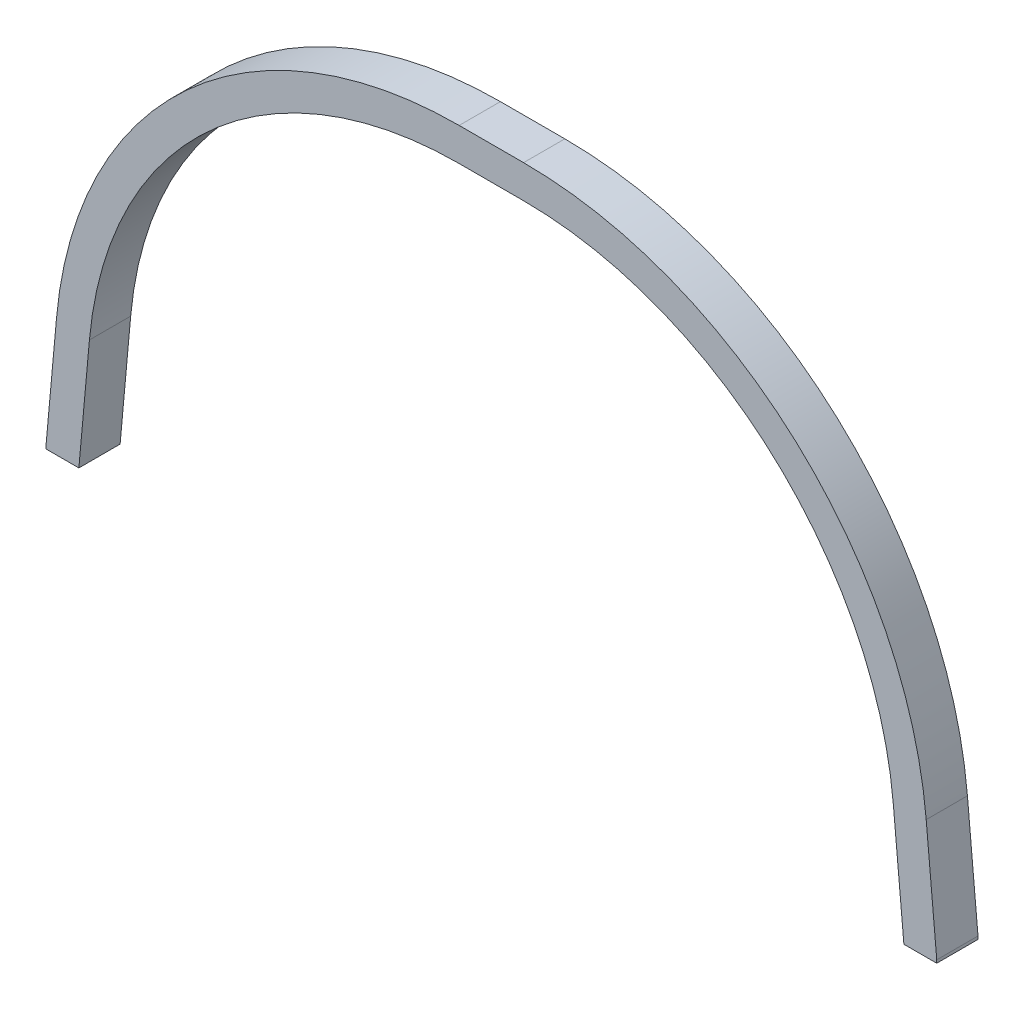
ISO-10303-21;
HEADER;
FILE_DESCRIPTION(('STEP AP214'),'2;1');
FILE_NAME('part.step','',(''),(''),'','','');
FILE_SCHEMA(('AUTOMOTIVE_DESIGN { 1 0 10303 214 1 1 1 1 }'));
ENDSEC;
DATA;
#1=APPLICATION_CONTEXT('core data for automotive mechanical design processes');
#2=APPLICATION_PROTOCOL_DEFINITION('international standard','automotive_design',2000,#1);
#3=PRODUCT_CONTEXT('',#1,'mechanical');
#4=PRODUCT('Part','Part','',(#3));
#5=PRODUCT_RELATED_PRODUCT_CATEGORY('part','',(#4));
#6=PRODUCT_DEFINITION_FORMATION('','',#4);
#7=PRODUCT_DEFINITION_CONTEXT('part definition',#1,'design');
#8=PRODUCT_DEFINITION('design','',#6,#7);
#9=PRODUCT_DEFINITION_SHAPE('','',#8);
#10=(LENGTH_UNIT() NAMED_UNIT(*) SI_UNIT(.MILLI.,.METRE.));
#11=(NAMED_UNIT(*) PLANE_ANGLE_UNIT() SI_UNIT($,.RADIAN.));
#12=(NAMED_UNIT(*) SI_UNIT($,.STERADIAN.) SOLID_ANGLE_UNIT());
#13=UNCERTAINTY_MEASURE_WITH_UNIT(LENGTH_MEASURE(1.E-05),#10,'distance_accuracy_value','');
#14=(GEOMETRIC_REPRESENTATION_CONTEXT(3) GLOBAL_UNCERTAINTY_ASSIGNED_CONTEXT((#13)) GLOBAL_UNIT_ASSIGNED_CONTEXT((#10,
#11,#12)) REPRESENTATION_CONTEXT('',''));
#15=CARTESIAN_POINT('',(0.,0.,0.));
#16=DIRECTION('',(0.,0.,1.));
#17=DIRECTION('',(1.,0.,0.));
#18=AXIS2_PLACEMENT_3D('',#15,#16,#17);
#19=CARTESIAN_POINT('',(0.,0.,5.));
#20=DIRECTION('',(0.,0.,-1.));
#21=DIRECTION('',(-1.,0.,0.));
#22=AXIS2_PLACEMENT_3D('',#19,#20,#21);
#23=PLANE('',#22);
#24=DIRECTION('',(0.,1.,0.));
#25=VECTOR('',#24,1.);
#26=CARTESIAN_POINT('',(141.483572825871,4.99999999999978,5.));
#27=LINE('',#26,#25);
#28=CARTESIAN_POINT('',(141.483572825871,4.99999999999978,5.));
#29=VERTEX_POINT('',#28);
#30=CARTESIAN_POINT('',(141.483572825871,5.3621429841698,5.));
#31=VERTEX_POINT('',#30);
#32=EDGE_CURVE('E147',#29,#31,#27,.T.);
#33=ORIENTED_EDGE('',*,*,#32,.T.);
#34=DIRECTION('',(0.0905357460425166,-0.995893206467704,0.));
#35=VECTOR('',#34,1.);
#36=CARTESIAN_POINT('',(140.204108410242,19.4362515560834,5.));
#37=LINE('',#36,#35);
#38=CARTESIAN_POINT('',(140.204108410242,19.4362515560834,5.));
#39=VERTEX_POINT('',#38);
#40=EDGE_CURVE('E335',#39,#31,#37,.T.);
#41=ORIENTED_EDGE('',*,*,#40,.F.);
#42=CARTESIAN_POINT('',(91.4053412933249,15.,5.));
#43=DIRECTION('',(0.,0.,1.));
#44=DIRECTION('',(1.,0.,0.));
#45=AXIS2_PLACEMENT_3D('',#42,#43,#44);
#46=CIRCLE('',#45,49.);
#47=CARTESIAN_POINT('',(91.4053412933249,64.,5.));
#48=VERTEX_POINT('',#47);
#49=EDGE_CURVE('E339',#39,#48,#46,.T.);
#50=ORIENTED_EDGE('',*,*,#49,.T.);
#51=DIRECTION('',(1.,0.,0.));
#52=VECTOR('',#51,1.);
#53=CARTESIAN_POINT('',(83.5946587066751,64.,5.));
#54=LINE('',#53,#52);
#55=CARTESIAN_POINT('',(83.5946587066751,64.,5.));
#56=VERTEX_POINT('',#55);
#57=EDGE_CURVE('E312',#56,#48,#54,.T.);
#58=ORIENTED_EDGE('',*,*,#57,.F.);
#59=CARTESIAN_POINT('',(83.5946587066751,15.,5.));
#60=DIRECTION('',(0.,0.,1.));
#61=DIRECTION('',(1.,0.,0.));
#62=AXIS2_PLACEMENT_3D('',#59,#60,#61);
#63=CIRCLE('',#62,49.);
#64=CARTESIAN_POINT('',(34.7958915897577,19.4362515560834,5.));
#65=VERTEX_POINT('',#64);
#66=EDGE_CURVE('E307',#56,#65,#63,.T.);
#67=ORIENTED_EDGE('',*,*,#66,.T.);
#68=DIRECTION('',(0.090535746042518,0.995893206467704,0.));
#69=VECTOR('',#68,1.);
#70=CARTESIAN_POINT('',(33.5164271741292,5.36214298417007,5.));
#71=LINE('',#70,#69);
#72=CARTESIAN_POINT('',(33.5164271741292,5.36214298417007,5.));
#73=VERTEX_POINT('',#72);
#74=EDGE_CURVE('E301',#73,#65,#71,.T.);
#75=ORIENTED_EDGE('',*,*,#74,.F.);
#76=DIRECTION('',(0.,1.,0.));
#77=VECTOR('',#76,1.);
#78=CARTESIAN_POINT('',(33.5164271741292,5.,5.));
#79=LINE('',#78,#77);
#80=CARTESIAN_POINT('',(33.5164271741292,5.,5.));
#81=VERTEX_POINT('',#80);
#82=EDGE_CURVE('E165',#81,#73,#79,.T.);
#83=ORIENTED_EDGE('',*,*,#82,.F.);
#84=DIRECTION('',(-1.,0.,0.));
#85=VECTOR('',#84,1.);
#86=CARTESIAN_POINT('',(23.75,5.,5.));
#87=LINE('',#86,#85);
#88=CARTESIAN_POINT('',(37.5,5.,5.));
#89=VERTEX_POINT('',#88);
#90=EDGE_CURVE('E152',#89,#81,#87,.T.);
#91=ORIENTED_EDGE('',*,*,#90,.F.);
#92=DIRECTION('',(0.0905357460425184,0.995893206467704,0.));
#93=VECTOR('',#92,1.);
#94=CARTESIAN_POINT('',(37.5,5.,5.));
#95=LINE('',#94,#93);
#96=CARTESIAN_POINT('',(38.7794644156285,19.0741085719133,5.));
#97=VERTEX_POINT('',#96);
#98=EDGE_CURVE('E182',#89,#97,#95,.T.);
#99=ORIENTED_EDGE('',*,*,#98,.T.);
#100=CARTESIAN_POINT('',(83.5946587066751,15.,5.));
#101=DIRECTION('',(0.,0.,-1.));
#102=DIRECTION('',(-1.,0.,0.));
#103=AXIS2_PLACEMENT_3D('',#100,#101,#102);
#104=CIRCLE('',#103,45.);
#105=CARTESIAN_POINT('',(83.5946587066751,60.,5.));
#106=VERTEX_POINT('',#105);
#107=EDGE_CURVE('E11',#97,#106,#104,.T.);
#108=ORIENTED_EDGE('',*,*,#107,.T.);
#109=DIRECTION('',(1.,0.,0.));
#110=VECTOR('',#109,1.);
#111=CARTESIAN_POINT('',(132.5,60.,5.));
#112=LINE('',#111,#110);
#113=CARTESIAN_POINT('',(91.4053412933249,60.,5.));
#114=VERTEX_POINT('',#113);
#115=EDGE_CURVE('E185',#106,#114,#112,.T.);
#116=ORIENTED_EDGE('',*,*,#115,.T.);
#117=CARTESIAN_POINT('',(91.4053412933249,15.,5.));
#118=DIRECTION('',(0.,0.,-1.));
#119=DIRECTION('',(-1.,0.,0.));
#120=AXIS2_PLACEMENT_3D('',#117,#118,#119);
#121=CIRCLE('',#120,45.);
#122=CARTESIAN_POINT('',(136.220535584372,19.0741085719134,5.));
#123=VERTEX_POINT('',#122);
#124=EDGE_CURVE('E224',#114,#123,#121,.T.);
#125=ORIENTED_EDGE('',*,*,#124,.T.);
#126=DIRECTION('',(0.0905357460425191,-0.995893206467704,0.));
#127=VECTOR('',#126,1.);
#128=CARTESIAN_POINT('',(137.5,5.00000000000002,5.));
#129=LINE('',#128,#127);
#130=CARTESIAN_POINT('',(137.5,4.99999999999974,5.));
#131=VERTEX_POINT('',#130);
#132=EDGE_CURVE('E190',#123,#131,#129,.T.);
#133=ORIENTED_EDGE('',*,*,#132,.T.);
#134=DIRECTION('',(-1.,0.,0.));
#135=VECTOR('',#134,1.);
#136=CARTESIAN_POINT('',(162.5,5.,5.));
#137=LINE('',#136,#135);
#138=EDGE_CURVE('E173',#29,#131,#137,.T.);
#139=ORIENTED_EDGE('',*,*,#138,.F.);
#140=EDGE_LOOP('',(#33,#41,#50,#58,#67,#75,#83,#91,#99,#108,#116,#125,#133,#139));
#141=FACE_BOUND('',#140,.T.);
#142=ADVANCED_FACE('F39',(#141),#23,.F.);
#143=CARTESIAN_POINT('',(0.,0.,0.));
#144=DIRECTION('',(0.,0.,-1.));
#145=DIRECTION('',(-1.,0.,0.));
#146=AXIS2_PLACEMENT_3D('',#143,#144,#145);
#147=PLANE('',#146);
#148=DIRECTION('',(0.0905357460425166,-0.995893206467704,0.));
#149=VECTOR('',#148,1.);
#150=CARTESIAN_POINT('',(140.204108410242,19.4362515560834,0.));
#151=LINE('',#150,#149);
#152=CARTESIAN_POINT('',(140.204108410242,19.4362515560834,0.));
#153=VERTEX_POINT('',#152);
#154=CARTESIAN_POINT('',(141.483572825871,5.3621429841698,0.));
#155=VERTEX_POINT('',#154);
#156=EDGE_CURVE('E163',#153,#155,#151,.T.);
#157=ORIENTED_EDGE('',*,*,#156,.T.);
#158=DIRECTION('',(0.,1.,0.));
#159=VECTOR('',#158,1.);
#160=CARTESIAN_POINT('',(141.483572825871,4.99999999999978,0.));
#161=LINE('',#160,#159);
#162=CARTESIAN_POINT('',(141.483572825871,4.99999999999978,0.));
#163=VERTEX_POINT('',#162);
#164=EDGE_CURVE('E144',#163,#155,#161,.T.);
#165=ORIENTED_EDGE('',*,*,#164,.F.);
#166=DIRECTION('',(-1.,0.,0.));
#167=VECTOR('',#166,1.);
#168=CARTESIAN_POINT('',(162.5,5.,0.));
#169=LINE('',#168,#167);
#170=CARTESIAN_POINT('',(137.5,5.00000000000002,0.));
#171=VERTEX_POINT('',#170);
#172=EDGE_CURVE('E159',#163,#171,#169,.T.);
#173=ORIENTED_EDGE('',*,*,#172,.T.);
#174=DIRECTION('',(0.0905357460425191,-0.995893206467704,0.));
#175=VECTOR('',#174,1.);
#176=CARTESIAN_POINT('',(137.5,5.00000000000002,0.));
#177=LINE('',#176,#175);
#178=CARTESIAN_POINT('',(136.220535584372,19.0741085719134,0.));
#179=VERTEX_POINT('',#178);
#180=EDGE_CURVE('E186',#179,#171,#177,.T.);
#181=ORIENTED_EDGE('',*,*,#180,.F.);
#182=CARTESIAN_POINT('',(91.4053412933249,15.,0.));
#183=DIRECTION('',(0.,0.,-1.));
#184=DIRECTION('',(-1.,0.,0.));
#185=AXIS2_PLACEMENT_3D('',#182,#183,#184);
#186=CIRCLE('',#185,45.);
#187=CARTESIAN_POINT('',(91.4053412933249,60.,0.));
#188=VERTEX_POINT('',#187);
#189=EDGE_CURVE('E221',#179,#188,#186,.F.);
#190=ORIENTED_EDGE('',*,*,#189,.T.);
#191=DIRECTION('',(1.,0.,0.));
#192=VECTOR('',#191,1.);
#193=CARTESIAN_POINT('',(132.5,60.,0.));
#194=LINE('',#193,#192);
#195=CARTESIAN_POINT('',(83.5946587066751,60.,0.));
#196=VERTEX_POINT('',#195);
#197=EDGE_CURVE('E177',#196,#188,#194,.T.);
#198=ORIENTED_EDGE('',*,*,#197,.F.);
#199=CARTESIAN_POINT('',(83.5946587066751,15.,0.));
#200=DIRECTION('',(0.,0.,-1.));
#201=DIRECTION('',(-1.,0.,0.));
#202=AXIS2_PLACEMENT_3D('',#199,#200,#201);
#203=CIRCLE('',#202,45.);
#204=CARTESIAN_POINT('',(38.7794644156285,19.0741085719133,0.));
#205=VERTEX_POINT('',#204);
#206=EDGE_CURVE('E48',#196,#205,#203,.F.);
#207=ORIENTED_EDGE('',*,*,#206,.T.);
#208=DIRECTION('',(0.0905357460425184,0.995893206467704,0.));
#209=VECTOR('',#208,1.);
#210=CARTESIAN_POINT('',(37.5,5.,0.));
#211=LINE('',#210,#209);
#212=CARTESIAN_POINT('',(37.5,5.,0.));
#213=VERTEX_POINT('',#212);
#214=EDGE_CURVE('E172',#213,#205,#211,.T.);
#215=ORIENTED_EDGE('',*,*,#214,.F.);
#216=DIRECTION('',(1.,0.,0.));
#217=VECTOR('',#216,1.);
#218=CARTESIAN_POINT('',(0.,5.,0.));
#219=LINE('',#218,#217);
#220=CARTESIAN_POINT('',(33.5164271741292,5.,0.));
#221=VERTEX_POINT('',#220);
#222=EDGE_CURVE('E205',#221,#213,#219,.T.);
#223=ORIENTED_EDGE('',*,*,#222,.F.);
#224=DIRECTION('',(0.,1.,0.));
#225=VECTOR('',#224,1.);
#226=CARTESIAN_POINT('',(33.5164271741292,5.,0.));
#227=LINE('',#226,#225);
#228=CARTESIAN_POINT('',(33.5164271741292,5.36214298417007,0.));
#229=VERTEX_POINT('',#228);
#230=EDGE_CURVE('E55',#221,#229,#227,.T.);
#231=ORIENTED_EDGE('',*,*,#230,.T.);
#232=DIRECTION('',(0.090535746042518,0.995893206467704,0.));
#233=VECTOR('',#232,1.);
#234=CARTESIAN_POINT('',(33.5164271741292,5.36214298417007,0.));
#235=LINE('',#234,#233);
#236=CARTESIAN_POINT('',(34.7958915897577,19.4362515560834,0.));
#237=VERTEX_POINT('',#236);
#238=EDGE_CURVE('E363',#229,#237,#235,.T.);
#239=ORIENTED_EDGE('',*,*,#238,.T.);
#240=CARTESIAN_POINT('',(83.5946587066751,15.,0.));
#241=DIRECTION('',(0.,0.,1.));
#242=DIRECTION('',(1.,0.,0.));
#243=AXIS2_PLACEMENT_3D('',#240,#241,#242);
#244=CIRCLE('',#243,49.);
#245=CARTESIAN_POINT('',(83.5946587066751,64.,0.));
#246=VERTEX_POINT('',#245);
#247=EDGE_CURVE('E358',#246,#237,#244,.T.);
#248=ORIENTED_EDGE('',*,*,#247,.F.);
#249=DIRECTION('',(1.,0.,0.));
#250=VECTOR('',#249,1.);
#251=CARTESIAN_POINT('',(83.5946587066751,64.,0.));
#252=LINE('',#251,#250);
#253=CARTESIAN_POINT('',(91.4053412933249,64.,0.));
#254=VERTEX_POINT('',#253);
#255=EDGE_CURVE('E354',#246,#254,#252,.T.);
#256=ORIENTED_EDGE('',*,*,#255,.T.);
#257=CARTESIAN_POINT('',(91.4053412933249,15.,0.));
#258=DIRECTION('',(0.,0.,1.));
#259=DIRECTION('',(1.,0.,0.));
#260=AXIS2_PLACEMENT_3D('',#257,#258,#259);
#261=CIRCLE('',#260,49.);
#262=EDGE_CURVE('E352',#153,#254,#261,.T.);
#263=ORIENTED_EDGE('',*,*,#262,.F.);
#264=EDGE_LOOP('',(#157,#165,#173,#181,#190,#198,#207,#215,#223,#231,#239,#248,#256,#263));
#265=FACE_BOUND('',#264,.T.);
#266=ADVANCED_FACE('F157',(#265),#147,.T.);
#267=CARTESIAN_POINT('',(162.5,5.,0.));
#268=DIRECTION('',(0.,1.,0.));
#269=DIRECTION('',(-1.,0.,0.));
#270=AXIS2_PLACEMENT_3D('',#267,#268,#269);
#271=PLANE('',#270);
#272=DIRECTION('',(0.,0.,1.));
#273=VECTOR('',#272,1.);
#274=CARTESIAN_POINT('',(141.483572825871,4.99999999999978,0.));
#275=LINE('',#274,#273);
#276=EDGE_CURVE('E141',#163,#29,#275,.T.);
#277=ORIENTED_EDGE('',*,*,#276,.T.);
#278=ORIENTED_EDGE('',*,*,#138,.T.);
#279=DIRECTION('',(0.,0.,-1.));
#280=VECTOR('',#279,1.);
#281=CARTESIAN_POINT('',(137.5,5.00000000000002,5.));
#282=LINE('',#281,#280);
#283=EDGE_CURVE('E170',#131,#171,#282,.T.);
#284=ORIENTED_EDGE('',*,*,#283,.T.);
#285=ORIENTED_EDGE('',*,*,#172,.F.);
#286=EDGE_LOOP('',(#277,#278,#284,#285));
#287=FACE_BOUND('',#286,.T.);
#288=ADVANCED_FACE('F168',(#287),#271,.F.);
#289=CARTESIAN_POINT('',(23.75,5.,0.));
#290=DIRECTION('',(0.,1.,0.));
#291=DIRECTION('',(-1.,0.,0.));
#292=AXIS2_PLACEMENT_3D('',#289,#290,#291);
#293=PLANE('',#292);
#294=DIRECTION('',(0.,0.,1.));
#295=VECTOR('',#294,1.);
#296=CARTESIAN_POINT('',(33.5164271741292,5.,0.));
#297=LINE('',#296,#295);
#298=EDGE_CURVE('E298',#221,#81,#297,.T.);
#299=ORIENTED_EDGE('',*,*,#298,.F.);
#300=ORIENTED_EDGE('',*,*,#222,.T.);
#301=DIRECTION('',(0.,0.,-1.));
#302=VECTOR('',#301,1.);
#303=CARTESIAN_POINT('',(37.5,5.,5.));
#304=LINE('',#303,#302);
#305=EDGE_CURVE('E201',#89,#213,#304,.T.);
#306=ORIENTED_EDGE('',*,*,#305,.F.);
#307=ORIENTED_EDGE('',*,*,#90,.T.);
#308=EDGE_LOOP('',(#299,#300,#306,#307));
#309=FACE_BOUND('',#308,.T.);
#310=ADVANCED_FACE('F263',(#309),#293,.F.);
#311=CARTESIAN_POINT('',(37.5,5.,5.));
#312=DIRECTION('',(-0.995893206467704,0.0905357460425184,0.));
#313=DIRECTION('',(-0.0905357460425184,-0.995893206467704,0.));
#314=AXIS2_PLACEMENT_3D('',#311,#312,#313);
#315=PLANE('',#314);
#316=ORIENTED_EDGE('',*,*,#214,.T.);
#317=DIRECTION('',(0.,0.,-1.));
#318=VECTOR('',#317,1.);
#319=CARTESIAN_POINT('',(38.7794644156285,19.0741085719133,5.));
#320=LINE('',#319,#318);
#321=EDGE_CURVE('E63',#205,#97,#320,.F.);
#322=ORIENTED_EDGE('',*,*,#321,.T.);
#323=ORIENTED_EDGE('',*,*,#98,.F.);
#324=ORIENTED_EDGE('',*,*,#305,.T.);
#325=EDGE_LOOP('',(#316,#322,#323,#324));
#326=FACE_BOUND('',#325,.T.);
#327=ADVANCED_FACE('F232',(#326),#315,.F.);
#328=CARTESIAN_POINT('',(132.5,60.,5.));
#329=DIRECTION('',(0.,1.,0.));
#330=DIRECTION('',(-1.,0.,0.));
#331=AXIS2_PLACEMENT_3D('',#328,#329,#330);
#332=PLANE('',#331);
#333=ORIENTED_EDGE('',*,*,#197,.T.);
#334=DIRECTION('',(0.,0.,-1.));
#335=VECTOR('',#334,1.);
#336=CARTESIAN_POINT('',(91.4053412933248,60.,5.));
#337=LINE('',#336,#335);
#338=EDGE_CURVE('E216',#188,#114,#337,.F.);
#339=ORIENTED_EDGE('',*,*,#338,.T.);
#340=ORIENTED_EDGE('',*,*,#115,.F.);
#341=DIRECTION('',(0.,0.,-1.));
#342=VECTOR('',#341,1.);
#343=CARTESIAN_POINT('',(83.5946587066751,60.,0.));
#344=LINE('',#343,#342);
#345=EDGE_CURVE('E212',#106,#196,#344,.T.);
#346=ORIENTED_EDGE('',*,*,#345,.T.);
#347=EDGE_LOOP('',(#333,#339,#340,#346));
#348=FACE_BOUND('',#347,.T.);
#349=ADVANCED_FACE('F239',(#348),#332,.F.);
#350=CARTESIAN_POINT('',(137.5,5.00000000000002,5.));
#351=DIRECTION('',(0.995893206467704,0.0905357460425191,0.));
#352=DIRECTION('',(-0.0905357460425191,0.995893206467704,0.));
#353=AXIS2_PLACEMENT_3D('',#350,#351,#352);
#354=PLANE('',#353);
#355=ORIENTED_EDGE('',*,*,#132,.F.);
#356=DIRECTION('',(0.,0.,-1.));
#357=VECTOR('',#356,1.);
#358=CARTESIAN_POINT('',(136.220535584372,19.0741085719134,0.));
#359=LINE('',#358,#357);
#360=EDGE_CURVE('E208',#123,#179,#359,.T.);
#361=ORIENTED_EDGE('',*,*,#360,.T.);
#362=ORIENTED_EDGE('',*,*,#180,.T.);
#363=ORIENTED_EDGE('',*,*,#283,.F.);
#364=EDGE_LOOP('',(#355,#361,#362,#363));
#365=FACE_BOUND('',#364,.T.);
#366=ADVANCED_FACE('F246',(#365),#354,.F.);
#367=CARTESIAN_POINT('',(91.4053412933249,15.,5.));
#368=DIRECTION('',(0.,0.,1.));
#369=DIRECTION('',(1.,0.,0.));
#370=AXIS2_PLACEMENT_3D('',#367,#368,#369);
#371=CYLINDRICAL_SURFACE('',#370,45.);
#372=ORIENTED_EDGE('',*,*,#124,.F.);
#373=ORIENTED_EDGE('',*,*,#338,.F.);
#374=ORIENTED_EDGE('',*,*,#189,.F.);
#375=ORIENTED_EDGE('',*,*,#360,.F.);
#376=EDGE_LOOP('',(#372,#373,#374,#375));
#377=FACE_BOUND('',#376,.T.);
#378=ADVANCED_FACE('F242',(#377),#371,.F.);
#379=CARTESIAN_POINT('',(83.5946587066751,15.,5.));
#380=DIRECTION('',(0.,0.,1.));
#381=DIRECTION('',(1.,0.,0.));
#382=AXIS2_PLACEMENT_3D('',#379,#380,#381);
#383=CYLINDRICAL_SURFACE('',#382,45.);
#384=ORIENTED_EDGE('',*,*,#107,.F.);
#385=ORIENTED_EDGE('',*,*,#321,.F.);
#386=ORIENTED_EDGE('',*,*,#206,.F.);
#387=ORIENTED_EDGE('',*,*,#345,.F.);
#388=EDGE_LOOP('',(#384,#385,#386,#387));
#389=FACE_BOUND('',#388,.T.);
#390=ADVANCED_FACE('F41',(#389),#383,.F.);
#391=CARTESIAN_POINT('',(141.483572825871,4.99999999999978,0.));
#392=DIRECTION('',(1.,0.,0.));
#393=DIRECTION('',(0.,0.,-1.));
#394=AXIS2_PLACEMENT_3D('',#391,#392,#393);
#395=PLANE('',#394);
#396=ORIENTED_EDGE('',*,*,#32,.F.);
#397=ORIENTED_EDGE('',*,*,#276,.F.);
#398=ORIENTED_EDGE('',*,*,#164,.T.);
#399=DIRECTION('',(0.,0.,1.));
#400=VECTOR('',#399,1.);
#401=CARTESIAN_POINT('',(141.483572825871,5.3621429841698,0.));
#402=LINE('',#401,#400);
#403=EDGE_CURVE('E153',#155,#31,#402,.T.);
#404=ORIENTED_EDGE('',*,*,#403,.T.);
#405=EDGE_LOOP('',(#396,#397,#398,#404));
#406=FACE_BOUND('',#405,.T.);
#407=ADVANCED_FACE('F143',(#406),#395,.T.);
#408=CARTESIAN_POINT('',(140.204108410242,19.4362515560834,0.));
#409=DIRECTION('',(-0.995893206467704,-0.0905357460425166,0.));
#410=DIRECTION('',(0.0905357460425166,-0.995893206467704,0.));
#411=AXIS2_PLACEMENT_3D('',#408,#409,#410);
#412=PLANE('',#411);
#413=ORIENTED_EDGE('',*,*,#40,.T.);
#414=ORIENTED_EDGE('',*,*,#403,.F.);
#415=ORIENTED_EDGE('',*,*,#156,.F.);
#416=DIRECTION('',(0.,0.,1.));
#417=VECTOR('',#416,1.);
#418=CARTESIAN_POINT('',(140.204108410242,19.4362515560834,0.));
#419=LINE('',#418,#417);
#420=EDGE_CURVE('E329',#153,#39,#419,.T.);
#421=ORIENTED_EDGE('',*,*,#420,.T.);
#422=EDGE_LOOP('',(#413,#414,#415,#421));
#423=FACE_BOUND('',#422,.T.);
#424=ADVANCED_FACE('F269',(#423),#412,.F.);
#425=CARTESIAN_POINT('',(91.4053412933249,15.,0.));
#426=DIRECTION('',(0.,0.,1.));
#427=DIRECTION('',(1.,0.,0.));
#428=AXIS2_PLACEMENT_3D('',#425,#426,#427);
#429=CYLINDRICAL_SURFACE('',#428,49.);
#430=ORIENTED_EDGE('',*,*,#49,.F.);
#431=ORIENTED_EDGE('',*,*,#420,.F.);
#432=ORIENTED_EDGE('',*,*,#262,.T.);
#433=DIRECTION('',(0.,0.,1.));
#434=VECTOR('',#433,1.);
#435=CARTESIAN_POINT('',(91.4053412933249,64.,0.));
#436=LINE('',#435,#434);
#437=EDGE_CURVE('E326',#254,#48,#436,.T.);
#438=ORIENTED_EDGE('',*,*,#437,.T.);
#439=EDGE_LOOP('',(#430,#431,#432,#438));
#440=FACE_BOUND('',#439,.T.);
#441=ADVANCED_FACE('F272',(#440),#429,.T.);
#442=CARTESIAN_POINT('',(83.5946587066751,64.,0.));
#443=DIRECTION('',(0.,-1.,0.));
#444=DIRECTION('',(0.,0.,-1.));
#445=AXIS2_PLACEMENT_3D('',#442,#443,#444);
#446=PLANE('',#445);
#447=ORIENTED_EDGE('',*,*,#57,.T.);
#448=ORIENTED_EDGE('',*,*,#437,.F.);
#449=ORIENTED_EDGE('',*,*,#255,.F.);
#450=DIRECTION('',(0.,0.,1.));
#451=VECTOR('',#450,1.);
#452=CARTESIAN_POINT('',(83.5946587066751,64.,0.));
#453=LINE('',#452,#451);
#454=EDGE_CURVE('E323',#246,#56,#453,.T.);
#455=ORIENTED_EDGE('',*,*,#454,.T.);
#456=EDGE_LOOP('',(#447,#448,#449,#455));
#457=FACE_BOUND('',#456,.T.);
#458=ADVANCED_FACE('F276',(#457),#446,.F.);
#459=CARTESIAN_POINT('',(83.5946587066751,15.,0.));
#460=DIRECTION('',(0.,0.,1.));
#461=DIRECTION('',(1.,0.,0.));
#462=AXIS2_PLACEMENT_3D('',#459,#460,#461);
#463=CYLINDRICAL_SURFACE('',#462,49.);
#464=ORIENTED_EDGE('',*,*,#66,.F.);
#465=ORIENTED_EDGE('',*,*,#454,.F.);
#466=ORIENTED_EDGE('',*,*,#247,.T.);
#467=DIRECTION('',(0.,0.,1.));
#468=VECTOR('',#467,1.);
#469=CARTESIAN_POINT('',(34.7958915897577,19.4362515560834,0.));
#470=LINE('',#469,#468);
#471=EDGE_CURVE('E320',#237,#65,#470,.T.);
#472=ORIENTED_EDGE('',*,*,#471,.T.);
#473=EDGE_LOOP('',(#464,#465,#466,#472));
#474=FACE_BOUND('',#473,.T.);
#475=ADVANCED_FACE('F280',(#474),#463,.T.);
#476=CARTESIAN_POINT('',(33.5164271741292,5.36214298417007,0.));
#477=DIRECTION('',(0.995893206467704,-0.090535746042518,0.));
#478=DIRECTION('',(0.090535746042518,0.995893206467704,0.));
#479=AXIS2_PLACEMENT_3D('',#476,#477,#478);
#480=PLANE('',#479);
#481=ORIENTED_EDGE('',*,*,#74,.T.);
#482=ORIENTED_EDGE('',*,*,#471,.F.);
#483=ORIENTED_EDGE('',*,*,#238,.F.);
#484=DIRECTION('',(0.,0.,1.));
#485=VECTOR('',#484,1.);
#486=CARTESIAN_POINT('',(33.5164271741292,5.36214298417007,0.));
#487=LINE('',#486,#485);
#488=EDGE_CURVE('E296',#229,#73,#487,.T.);
#489=ORIENTED_EDGE('',*,*,#488,.T.);
#490=EDGE_LOOP('',(#481,#482,#483,#489));
#491=FACE_BOUND('',#490,.T.);
#492=ADVANCED_FACE('F284',(#491),#480,.F.);
#493=CARTESIAN_POINT('',(33.5164271741292,5.,0.));
#494=DIRECTION('',(1.,0.,0.));
#495=DIRECTION('',(0.,0.,-1.));
#496=AXIS2_PLACEMENT_3D('',#493,#494,#495);
#497=PLANE('',#496);
#498=ORIENTED_EDGE('',*,*,#82,.T.);
#499=ORIENTED_EDGE('',*,*,#488,.F.);
#500=ORIENTED_EDGE('',*,*,#230,.F.);
#501=ORIENTED_EDGE('',*,*,#298,.T.);
#502=EDGE_LOOP('',(#498,#499,#500,#501));
#503=FACE_BOUND('',#502,.T.);
#504=ADVANCED_FACE('F288',(#503),#497,.F.);
#505=CLOSED_SHELL('',(#142,#266,#288,#310,#327,#349,#366,#378,#390,#407,#424,#441,#458,#475,
#492,#504));
#506=MANIFOLD_SOLID_BREP('B2',#505);
#507=ADVANCED_BREP_SHAPE_REPRESENTATION('',(#18,#506),#14);
#508=SHAPE_DEFINITION_REPRESENTATION(#9,#507);
ENDSEC;
END-ISO-10303-21;
